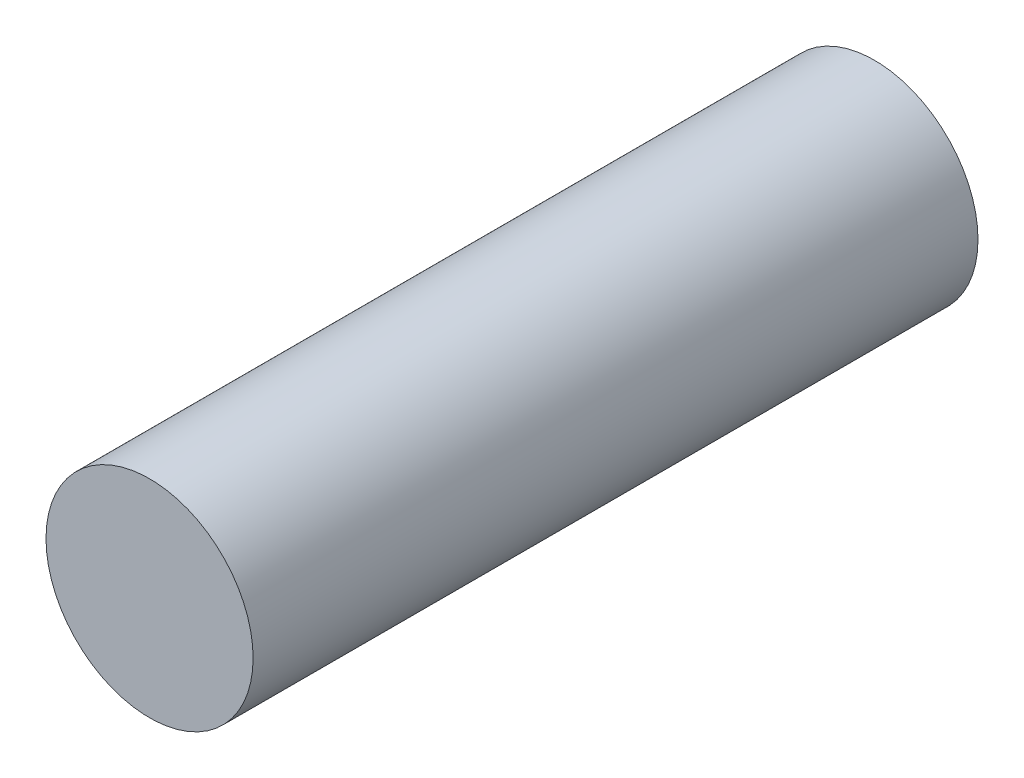
ISO-10303-21;
HEADER;
FILE_DESCRIPTION(('STEP AP214'),'2;1');
FILE_NAME('part.step','',(''),(''),'','','');
FILE_SCHEMA(('AUTOMOTIVE_DESIGN { 1 0 10303 214 1 1 1 1 }'));
ENDSEC;
DATA;
#1=APPLICATION_CONTEXT('core data for automotive mechanical design processes');
#2=APPLICATION_PROTOCOL_DEFINITION('international standard','automotive_design',2000,#1);
#3=PRODUCT_CONTEXT('',#1,'mechanical');
#4=PRODUCT('Part','Part','',(#3));
#5=PRODUCT_RELATED_PRODUCT_CATEGORY('part','',(#4));
#6=PRODUCT_DEFINITION_FORMATION('','',#4);
#7=PRODUCT_DEFINITION_CONTEXT('part definition',#1,'design');
#8=PRODUCT_DEFINITION('design','',#6,#7);
#9=PRODUCT_DEFINITION_SHAPE('','',#8);
#10=(LENGTH_UNIT() NAMED_UNIT(*) SI_UNIT(.MILLI.,.METRE.));
#11=(NAMED_UNIT(*) PLANE_ANGLE_UNIT() SI_UNIT($,.RADIAN.));
#12=(NAMED_UNIT(*) SI_UNIT($,.STERADIAN.) SOLID_ANGLE_UNIT());
#13=UNCERTAINTY_MEASURE_WITH_UNIT(LENGTH_MEASURE(1.E-05),#10,'distance_accuracy_value','');
#14=(GEOMETRIC_REPRESENTATION_CONTEXT(3) GLOBAL_UNCERTAINTY_ASSIGNED_CONTEXT((#13)) GLOBAL_UNIT_ASSIGNED_CONTEXT((#10,
#11,#12)) REPRESENTATION_CONTEXT('',''));
#15=CARTESIAN_POINT('',(0.,0.,0.));
#16=DIRECTION('',(0.,0.,1.));
#17=DIRECTION('',(1.,0.,0.));
#18=AXIS2_PLACEMENT_3D('',#15,#16,#17);
#19=CARTESIAN_POINT('',(-10.,-10.,-35.));
#20=DIRECTION('',(0.,0.,-1.));
#21=DIRECTION('',(-1.,0.,0.));
#22=AXIS2_PLACEMENT_3D('',#19,#20,#21);
#23=PLANE('',#22);
#24=CARTESIAN_POINT('',(0.,0.,-35.));
#25=DIRECTION('',(0.,0.,-1.));
#26=DIRECTION('',(-1.,0.,0.));
#27=AXIS2_PLACEMENT_3D('',#24,#25,#26);
#28=CIRCLE('',#27,5.);
#29=CARTESIAN_POINT('',(-5.,0.,-35.));
#30=VERTEX_POINT('',#29);
#31=EDGE_CURVE('E10',#30,#30,#28,.F.);
#32=ORIENTED_EDGE('',*,*,#31,.F.);
#33=EDGE_LOOP('',(#32));
#34=FACE_BOUND('',#33,.T.);
#35=ADVANCED_FACE('F32',(#34),#23,.T.);
#36=CARTESIAN_POINT('',(0.,0.,0.));
#37=DIRECTION('',(0.,0.,1.));
#38=DIRECTION('',(1.,0.,0.));
#39=AXIS2_PLACEMENT_3D('',#36,#37,#38);
#40=PLANE('',#39);
#41=CARTESIAN_POINT('',(0.,0.,0.));
#42=DIRECTION('',(0.,0.,1.));
#43=DIRECTION('',(1.,0.,0.));
#44=AXIS2_PLACEMENT_3D('',#41,#42,#43);
#45=CIRCLE('',#44,5.);
#46=CARTESIAN_POINT('',(5.,0.,0.));
#47=VERTEX_POINT('',#46);
#48=EDGE_CURVE('E38',#47,#47,#45,.T.);
#49=ORIENTED_EDGE('',*,*,#48,.T.);
#50=EDGE_LOOP('',(#49));
#51=FACE_BOUND('',#50,.T.);
#52=ADVANCED_FACE('F44',(#51),#40,.T.);
#53=CARTESIAN_POINT('',(0.,0.,-49.142135623731));
#54=DIRECTION('',(0.,0.,1.));
#55=DIRECTION('',(1.,0.,0.));
#56=AXIS2_PLACEMENT_3D('',#53,#54,#55);
#57=CYLINDRICAL_SURFACE('',#56,5.);
#58=ORIENTED_EDGE('',*,*,#48,.F.);
#59=EDGE_LOOP('',(#58));
#60=FACE_BOUND('',#59,.T.);
#61=ORIENTED_EDGE('',*,*,#31,.T.);
#62=EDGE_LOOP('',(#61));
#63=FACE_BOUND('',#62,.T.);
#64=ADVANCED_FACE('F46',(#60,#63),#57,.T.);
#65=CLOSED_SHELL('',(#35,#52,#64));
#66=MANIFOLD_SOLID_BREP('B2',#65);
#67=ADVANCED_BREP_SHAPE_REPRESENTATION('',(#18,#66),#14);
#68=SHAPE_DEFINITION_REPRESENTATION(#9,#67);
ENDSEC;
END-ISO-10303-21;
